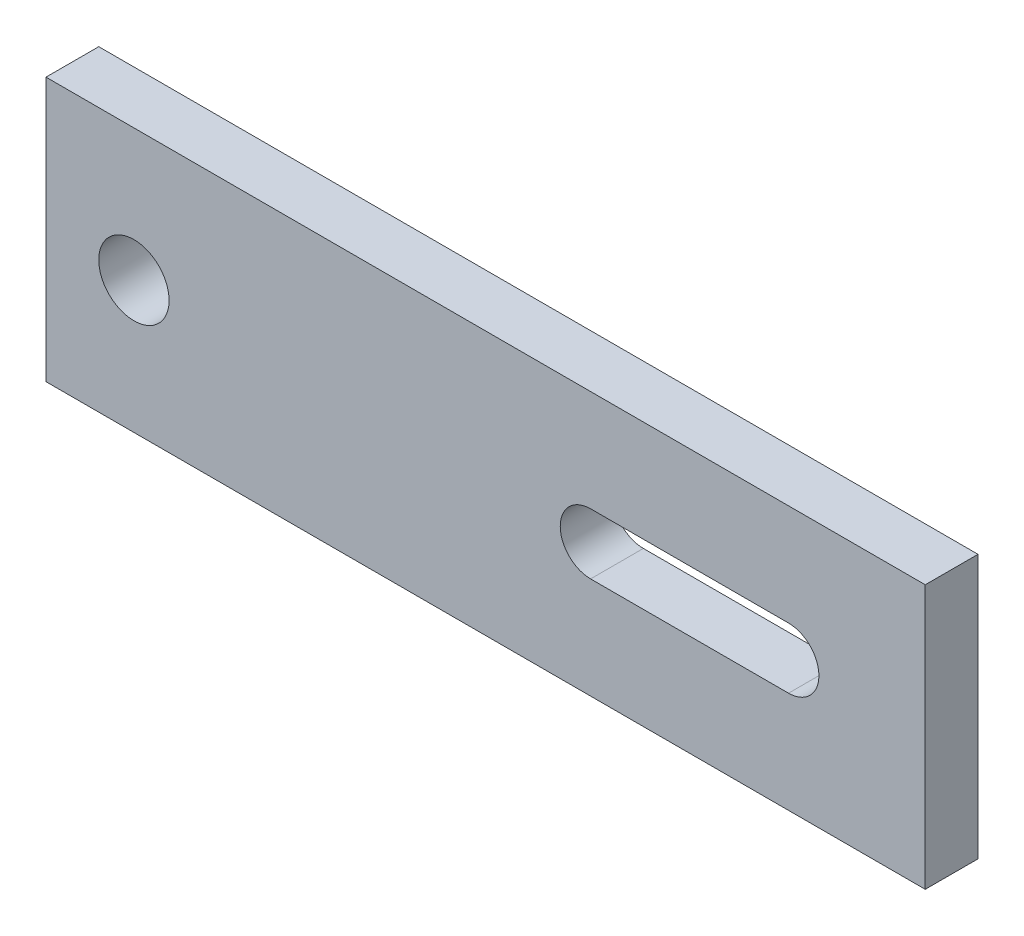
ISO-10303-21;
HEADER;
FILE_DESCRIPTION(('STEP AP214'),'2;1');
FILE_NAME('part.step','',(''),(''),'','','');
FILE_SCHEMA(('AUTOMOTIVE_DESIGN { 1 0 10303 214 1 1 1 1 }'));
ENDSEC;
DATA;
#1=APPLICATION_CONTEXT('core data for automotive mechanical design processes');
#2=APPLICATION_PROTOCOL_DEFINITION('international standard','automotive_design',2000,#1);
#3=PRODUCT_CONTEXT('',#1,'mechanical');
#4=PRODUCT('Part','Part','',(#3));
#5=PRODUCT_RELATED_PRODUCT_CATEGORY('part','',(#4));
#6=PRODUCT_DEFINITION_FORMATION('','',#4);
#7=PRODUCT_DEFINITION_CONTEXT('part definition',#1,'design');
#8=PRODUCT_DEFINITION('design','',#6,#7);
#9=PRODUCT_DEFINITION_SHAPE('','',#8);
#10=(LENGTH_UNIT() NAMED_UNIT(*) SI_UNIT(.MILLI.,.METRE.));
#11=(NAMED_UNIT(*) PLANE_ANGLE_UNIT() SI_UNIT($,.RADIAN.));
#12=(NAMED_UNIT(*) SI_UNIT($,.STERADIAN.) SOLID_ANGLE_UNIT());
#13=UNCERTAINTY_MEASURE_WITH_UNIT(LENGTH_MEASURE(1.E-05),#10,'distance_accuracy_value','');
#14=(GEOMETRIC_REPRESENTATION_CONTEXT(3) GLOBAL_UNCERTAINTY_ASSIGNED_CONTEXT((#13)) GLOBAL_UNIT_ASSIGNED_CONTEXT((#10,
#11,#12)) REPRESENTATION_CONTEXT('',''));
#15=CARTESIAN_POINT('',(0.,0.,0.));
#16=DIRECTION('',(0.,0.,1.));
#17=DIRECTION('',(1.,0.,0.));
#18=AXIS2_PLACEMENT_3D('',#15,#16,#17);
#19=CARTESIAN_POINT('',(25.,7.5,3.));
#20=DIRECTION('',(-1.,0.,0.));
#21=DIRECTION('',(0.,0.,1.));
#22=AXIS2_PLACEMENT_3D('',#19,#20,#21);
#23=PLANE('',#22);
#24=DIRECTION('',(0.,1.,0.));
#25=VECTOR('',#24,1.);
#26=CARTESIAN_POINT('',(25.,7.5,0.));
#27=LINE('',#26,#25);
#28=CARTESIAN_POINT('',(25.,-7.5,0.));
#29=VERTEX_POINT('',#28);
#30=CARTESIAN_POINT('',(25.,7.5,0.));
#31=VERTEX_POINT('',#30);
#32=EDGE_CURVE('E141',#29,#31,#27,.T.);
#33=ORIENTED_EDGE('',*,*,#32,.T.);
#34=DIRECTION('',(0.,0.,-1.));
#35=VECTOR('',#34,1.);
#36=CARTESIAN_POINT('',(25.,7.5,3.));
#37=LINE('',#36,#35);
#38=CARTESIAN_POINT('',(25.,7.5,3.));
#39=VERTEX_POINT('',#38);
#40=EDGE_CURVE('E11',#39,#31,#37,.T.);
#41=ORIENTED_EDGE('',*,*,#40,.F.);
#42=DIRECTION('',(0.,1.,0.));
#43=VECTOR('',#42,1.);
#44=CARTESIAN_POINT('',(25.,7.5,3.));
#45=LINE('',#44,#43);
#46=CARTESIAN_POINT('',(25.,-7.5,3.));
#47=VERTEX_POINT('',#46);
#48=EDGE_CURVE('E144',#47,#39,#45,.T.);
#49=ORIENTED_EDGE('',*,*,#48,.F.);
#50=DIRECTION('',(0.,0.,-1.));
#51=VECTOR('',#50,1.);
#52=CARTESIAN_POINT('',(25.,-7.5,3.));
#53=LINE('',#52,#51);
#54=EDGE_CURVE('E154',#47,#29,#53,.T.);
#55=ORIENTED_EDGE('',*,*,#54,.T.);
#56=EDGE_LOOP('',(#33,#41,#49,#55));
#57=FACE_BOUND('',#56,.T.);
#58=ADVANCED_FACE('F37',(#57),#23,.F.);
#59=CARTESIAN_POINT('',(-25.,7.5,3.));
#60=DIRECTION('',(0.,-1.,0.));
#61=DIRECTION('',(0.,0.,-1.));
#62=AXIS2_PLACEMENT_3D('',#59,#60,#61);
#63=PLANE('',#62);
#64=DIRECTION('',(-1.,0.,0.));
#65=VECTOR('',#64,1.);
#66=CARTESIAN_POINT('',(-25.,7.5,0.));
#67=LINE('',#66,#65);
#68=CARTESIAN_POINT('',(-25.,7.5,0.));
#69=VERTEX_POINT('',#68);
#70=EDGE_CURVE('E157',#31,#69,#67,.T.);
#71=ORIENTED_EDGE('',*,*,#70,.T.);
#72=DIRECTION('',(0.,0.,-1.));
#73=VECTOR('',#72,1.);
#74=CARTESIAN_POINT('',(-25.,7.5,3.));
#75=LINE('',#74,#73);
#76=CARTESIAN_POINT('',(-25.,7.5,3.));
#77=VERTEX_POINT('',#76);
#78=EDGE_CURVE('E44',#77,#69,#75,.T.);
#79=ORIENTED_EDGE('',*,*,#78,.F.);
#80=DIRECTION('',(-1.,0.,0.));
#81=VECTOR('',#80,1.);
#82=CARTESIAN_POINT('',(-25.,7.5,3.));
#83=LINE('',#82,#81);
#84=EDGE_CURVE('E147',#39,#77,#83,.T.);
#85=ORIENTED_EDGE('',*,*,#84,.F.);
#86=ORIENTED_EDGE('',*,*,#40,.T.);
#87=EDGE_LOOP('',(#71,#79,#85,#86));
#88=FACE_BOUND('',#87,.T.);
#89=ADVANCED_FACE('F186',(#88),#63,.F.);
#90=CARTESIAN_POINT('',(-25.,7.5,3.));
#91=DIRECTION('',(1.,0.,0.));
#92=DIRECTION('',(0.,0.,-1.));
#93=AXIS2_PLACEMENT_3D('',#90,#91,#92);
#94=PLANE('',#93);
#95=DIRECTION('',(0.,-1.,0.));
#96=VECTOR('',#95,1.);
#97=CARTESIAN_POINT('',(-25.,7.5,0.));
#98=LINE('',#97,#96);
#99=CARTESIAN_POINT('',(-25.,-7.5,0.));
#100=VERTEX_POINT('',#99);
#101=EDGE_CURVE('E159',#69,#100,#98,.T.);
#102=ORIENTED_EDGE('',*,*,#101,.T.);
#103=DIRECTION('',(0.,0.,-1.));
#104=VECTOR('',#103,1.);
#105=CARTESIAN_POINT('',(-25.,-7.5,3.));
#106=LINE('',#105,#104);
#107=CARTESIAN_POINT('',(-25.,-7.5,3.));
#108=VERTEX_POINT('',#107);
#109=EDGE_CURVE('E164',#108,#100,#106,.T.);
#110=ORIENTED_EDGE('',*,*,#109,.F.);
#111=DIRECTION('',(0.,-1.,0.));
#112=VECTOR('',#111,1.);
#113=CARTESIAN_POINT('',(-25.,7.5,3.));
#114=LINE('',#113,#112);
#115=EDGE_CURVE('E150',#77,#108,#114,.T.);
#116=ORIENTED_EDGE('',*,*,#115,.F.);
#117=ORIENTED_EDGE('',*,*,#78,.T.);
#118=EDGE_LOOP('',(#102,#110,#116,#117));
#119=FACE_BOUND('',#118,.T.);
#120=ADVANCED_FACE('F171',(#119),#94,.F.);
#121=CARTESIAN_POINT('',(-25.,-7.5,3.));
#122=DIRECTION('',(0.,1.,0.));
#123=DIRECTION('',(0.,0.,1.));
#124=AXIS2_PLACEMENT_3D('',#121,#122,#123);
#125=PLANE('',#124);
#126=DIRECTION('',(1.,0.,0.));
#127=VECTOR('',#126,1.);
#128=CARTESIAN_POINT('',(-25.,-7.5,0.));
#129=LINE('',#128,#127);
#130=EDGE_CURVE('E148',#100,#29,#129,.T.);
#131=ORIENTED_EDGE('',*,*,#130,.T.);
#132=ORIENTED_EDGE('',*,*,#54,.F.);
#133=DIRECTION('',(1.,0.,0.));
#134=VECTOR('',#133,1.);
#135=CARTESIAN_POINT('',(-25.,-7.5,3.));
#136=LINE('',#135,#134);
#137=EDGE_CURVE('E152',#108,#47,#136,.T.);
#138=ORIENTED_EDGE('',*,*,#137,.F.);
#139=ORIENTED_EDGE('',*,*,#109,.T.);
#140=EDGE_LOOP('',(#131,#132,#138,#139));
#141=FACE_BOUND('',#140,.T.);
#142=ADVANCED_FACE('F179',(#141),#125,.F.);
#143=CARTESIAN_POINT('',(0.,0.,3.));
#144=DIRECTION('',(0.,0.,1.));
#145=DIRECTION('',(1.,0.,0.));
#146=AXIS2_PLACEMENT_3D('',#143,#144,#145);
#147=PLANE('',#146);
#148=CARTESIAN_POINT('',(5.96940333440739,0.,3.));
#149=DIRECTION('',(0.,0.,1.));
#150=DIRECTION('',(1.,0.,0.));
#151=AXIS2_PLACEMENT_3D('',#148,#149,#150);
#152=CIRCLE('',#151,1.72671942875128);
#153=CARTESIAN_POINT('',(5.96940333440739,1.72671942875128,3.));
#154=VERTEX_POINT('',#153);
#155=CARTESIAN_POINT('',(5.96940333440739,-1.72671942875128,3.));
#156=VERTEX_POINT('',#155);
#157=EDGE_CURVE('E51',#154,#156,#152,.T.);
#158=ORIENTED_EDGE('',*,*,#157,.F.);
#159=DIRECTION('',(-1.,0.,0.));
#160=VECTOR('',#159,1.);
#161=CARTESIAN_POINT('',(5.96940333440739,1.72671942875128,3.));
#162=LINE('',#161,#160);
#163=CARTESIAN_POINT('',(17.2262825152981,1.72671942875128,3.));
#164=VERTEX_POINT('',#163);
#165=EDGE_CURVE('E119',#164,#154,#162,.T.);
#166=ORIENTED_EDGE('',*,*,#165,.F.);
#167=CARTESIAN_POINT('',(17.2262825152981,0.,3.));
#168=DIRECTION('',(0.,0.,1.));
#169=DIRECTION('',(1.,0.,0.));
#170=AXIS2_PLACEMENT_3D('',#167,#168,#169);
#171=CIRCLE('',#170,1.72671942875128);
#172=CARTESIAN_POINT('',(17.2262825152981,-1.72671942875128,3.));
#173=VERTEX_POINT('',#172);
#174=EDGE_CURVE('E122',#173,#164,#171,.T.);
#175=ORIENTED_EDGE('',*,*,#174,.F.);
#176=DIRECTION('',(1.,0.,0.));
#177=VECTOR('',#176,1.);
#178=CARTESIAN_POINT('',(5.96940333440739,-1.72671942875128,3.));
#179=LINE('',#178,#177);
#180=EDGE_CURVE('E128',#156,#173,#179,.T.);
#181=ORIENTED_EDGE('',*,*,#180,.F.);
#182=EDGE_LOOP('',(#158,#166,#175,#181));
#183=FACE_BOUND('',#182,.T.);
#184=CARTESIAN_POINT('',(-20.,0.,3.));
#185=DIRECTION('',(0.,0.,1.));
#186=DIRECTION('',(1.,0.,0.));
#187=AXIS2_PLACEMENT_3D('',#184,#185,#186);
#188=CIRCLE('',#187,2.);
#189=CARTESIAN_POINT('',(-18.,0.,3.));
#190=VERTEX_POINT('',#189);
#191=EDGE_CURVE('E134',#190,#190,#188,.T.);
#192=ORIENTED_EDGE('',*,*,#191,.F.);
#193=EDGE_LOOP('',(#192));
#194=FACE_BOUND('',#193,.T.);
#195=ORIENTED_EDGE('',*,*,#48,.T.);
#196=ORIENTED_EDGE('',*,*,#84,.T.);
#197=ORIENTED_EDGE('',*,*,#115,.T.);
#198=ORIENTED_EDGE('',*,*,#137,.T.);
#199=EDGE_LOOP('',(#195,#196,#197,#198));
#200=FACE_BOUND('',#199,.T.);
#201=ADVANCED_FACE('F185',(#183,#194,#200),#147,.T.);
#202=CARTESIAN_POINT('',(0.,0.,0.));
#203=DIRECTION('',(0.,0.,1.));
#204=DIRECTION('',(1.,0.,0.));
#205=AXIS2_PLACEMENT_3D('',#202,#203,#204);
#206=PLANE('',#205);
#207=DIRECTION('',(-1.,0.,0.));
#208=VECTOR('',#207,1.);
#209=CARTESIAN_POINT('',(5.96940333440739,1.72671942875128,0.));
#210=LINE('',#209,#208);
#211=CARTESIAN_POINT('',(17.2262825152981,1.72671942875128,0.));
#212=VERTEX_POINT('',#211);
#213=CARTESIAN_POINT('',(5.96940333440739,1.72671942875128,0.));
#214=VERTEX_POINT('',#213);
#215=EDGE_CURVE('E109',#212,#214,#210,.T.);
#216=ORIENTED_EDGE('',*,*,#215,.T.);
#217=CARTESIAN_POINT('',(5.96940333440739,0.,0.));
#218=DIRECTION('',(0.,0.,1.));
#219=DIRECTION('',(1.,0.,0.));
#220=AXIS2_PLACEMENT_3D('',#217,#218,#219);
#221=CIRCLE('',#220,1.72671942875128);
#222=CARTESIAN_POINT('',(5.96940333440739,-1.72671942875128,0.));
#223=VERTEX_POINT('',#222);
#224=EDGE_CURVE('E103',#214,#223,#221,.T.);
#225=ORIENTED_EDGE('',*,*,#224,.T.);
#226=DIRECTION('',(1.,0.,0.));
#227=VECTOR('',#226,1.);
#228=CARTESIAN_POINT('',(5.96940333440739,-1.72671942875128,0.));
#229=LINE('',#228,#227);
#230=CARTESIAN_POINT('',(17.2262825152981,-1.72671942875128,0.));
#231=VERTEX_POINT('',#230);
#232=EDGE_CURVE('E112',#223,#231,#229,.T.);
#233=ORIENTED_EDGE('',*,*,#232,.T.);
#234=CARTESIAN_POINT('',(17.2262825152981,0.,0.));
#235=DIRECTION('',(0.,0.,1.));
#236=DIRECTION('',(1.,0.,0.));
#237=AXIS2_PLACEMENT_3D('',#234,#235,#236);
#238=CIRCLE('',#237,1.72671942875128);
#239=EDGE_CURVE('E59',#231,#212,#238,.T.);
#240=ORIENTED_EDGE('',*,*,#239,.T.);
#241=EDGE_LOOP('',(#216,#225,#233,#240));
#242=FACE_BOUND('',#241,.T.);
#243=CARTESIAN_POINT('',(-20.,0.,0.));
#244=DIRECTION('',(0.,0.,1.));
#245=DIRECTION('',(1.,0.,0.));
#246=AXIS2_PLACEMENT_3D('',#243,#244,#245);
#247=CIRCLE('',#246,2.);
#248=CARTESIAN_POINT('',(-18.,0.,0.));
#249=VERTEX_POINT('',#248);
#250=EDGE_CURVE('E138',#249,#249,#247,.T.);
#251=ORIENTED_EDGE('',*,*,#250,.T.);
#252=EDGE_LOOP('',(#251));
#253=FACE_BOUND('',#252,.T.);
#254=ORIENTED_EDGE('',*,*,#32,.F.);
#255=ORIENTED_EDGE('',*,*,#130,.F.);
#256=ORIENTED_EDGE('',*,*,#101,.F.);
#257=ORIENTED_EDGE('',*,*,#70,.F.);
#258=EDGE_LOOP('',(#254,#255,#256,#257));
#259=FACE_BOUND('',#258,.T.);
#260=ADVANCED_FACE('F116',(#242,#253,#259),#206,.F.);
#261=CARTESIAN_POINT('',(-20.,0.,0.));
#262=DIRECTION('',(0.,0.,1.));
#263=DIRECTION('',(1.,0.,0.));
#264=AXIS2_PLACEMENT_3D('',#261,#262,#263);
#265=CYLINDRICAL_SURFACE('',#264,2.);
#266=ORIENTED_EDGE('',*,*,#250,.F.);
#267=EDGE_LOOP('',(#266));
#268=FACE_BOUND('',#267,.T.);
#269=ORIENTED_EDGE('',*,*,#191,.T.);
#270=EDGE_LOOP('',(#269));
#271=FACE_BOUND('',#270,.T.);
#272=ADVANCED_FACE('F198',(#268,#271),#265,.F.);
#273=CARTESIAN_POINT('',(5.96940333440739,0.,0.));
#274=DIRECTION('',(0.,0.,1.));
#275=DIRECTION('',(1.,0.,0.));
#276=AXIS2_PLACEMENT_3D('',#273,#274,#275);
#277=CYLINDRICAL_SURFACE('',#276,1.72671942875128);
#278=ORIENTED_EDGE('',*,*,#157,.T.);
#279=DIRECTION('',(0.,0.,1.));
#280=VECTOR('',#279,1.);
#281=CARTESIAN_POINT('',(5.96940333440739,-1.72671942875128,0.));
#282=LINE('',#281,#280);
#283=EDGE_CURVE('E99',#223,#156,#282,.T.);
#284=ORIENTED_EDGE('',*,*,#283,.F.);
#285=ORIENTED_EDGE('',*,*,#224,.F.);
#286=DIRECTION('',(0.,0.,1.));
#287=VECTOR('',#286,1.);
#288=CARTESIAN_POINT('',(5.96940333440739,1.72671942875128,0.));
#289=LINE('',#288,#287);
#290=EDGE_CURVE('E132',#214,#154,#289,.T.);
#291=ORIENTED_EDGE('',*,*,#290,.T.);
#292=EDGE_LOOP('',(#278,#284,#285,#291));
#293=FACE_BOUND('',#292,.T.);
#294=ADVANCED_FACE('F101',(#293),#277,.F.);
#295=CARTESIAN_POINT('',(5.96940333440739,1.72671942875128,0.));
#296=DIRECTION('',(0.,1.,0.));
#297=DIRECTION('',(0.,0.,1.));
#298=AXIS2_PLACEMENT_3D('',#295,#296,#297);
#299=PLANE('',#298);
#300=ORIENTED_EDGE('',*,*,#165,.T.);
#301=ORIENTED_EDGE('',*,*,#290,.F.);
#302=ORIENTED_EDGE('',*,*,#215,.F.);
#303=DIRECTION('',(0.,0.,1.));
#304=VECTOR('',#303,1.);
#305=CARTESIAN_POINT('',(17.2262825152981,1.72671942875128,0.));
#306=LINE('',#305,#304);
#307=EDGE_CURVE('E135',#212,#164,#306,.T.);
#308=ORIENTED_EDGE('',*,*,#307,.T.);
#309=EDGE_LOOP('',(#300,#301,#302,#308));
#310=FACE_BOUND('',#309,.T.);
#311=ADVANCED_FACE('F207',(#310),#299,.F.);
#312=CARTESIAN_POINT('',(17.2262825152981,0.,0.));
#313=DIRECTION('',(0.,0.,1.));
#314=DIRECTION('',(1.,0.,0.));
#315=AXIS2_PLACEMENT_3D('',#312,#313,#314);
#316=CYLINDRICAL_SURFACE('',#315,1.72671942875128);
#317=ORIENTED_EDGE('',*,*,#174,.T.);
#318=ORIENTED_EDGE('',*,*,#307,.F.);
#319=ORIENTED_EDGE('',*,*,#239,.F.);
#320=DIRECTION('',(0.,0.,1.));
#321=VECTOR('',#320,1.);
#322=CARTESIAN_POINT('',(17.2262825152981,-1.72671942875128,0.));
#323=LINE('',#322,#321);
#324=EDGE_CURVE('E108',#231,#173,#323,.T.);
#325=ORIENTED_EDGE('',*,*,#324,.T.);
#326=EDGE_LOOP('',(#317,#318,#319,#325));
#327=FACE_BOUND('',#326,.T.);
#328=ADVANCED_FACE('F210',(#327),#316,.F.);
#329=CARTESIAN_POINT('',(5.96940333440739,-1.72671942875128,0.));
#330=DIRECTION('',(0.,-1.,0.));
#331=DIRECTION('',(0.,0.,-1.));
#332=AXIS2_PLACEMENT_3D('',#329,#330,#331);
#333=PLANE('',#332);
#334=ORIENTED_EDGE('',*,*,#180,.T.);
#335=ORIENTED_EDGE('',*,*,#324,.F.);
#336=ORIENTED_EDGE('',*,*,#232,.F.);
#337=ORIENTED_EDGE('',*,*,#283,.T.);
#338=EDGE_LOOP('',(#334,#335,#336,#337));
#339=FACE_BOUND('',#338,.T.);
#340=ADVANCED_FACE('F113',(#339),#333,.F.);
#341=CLOSED_SHELL('',(#58,#89,#120,#142,#201,#260,#272,#294,#311,#328,#340));
#342=MANIFOLD_SOLID_BREP('B2',#341);
#343=ADVANCED_BREP_SHAPE_REPRESENTATION('',(#18,#342),#14);
#344=SHAPE_DEFINITION_REPRESENTATION(#9,#343);
ENDSEC;
END-ISO-10303-21;
